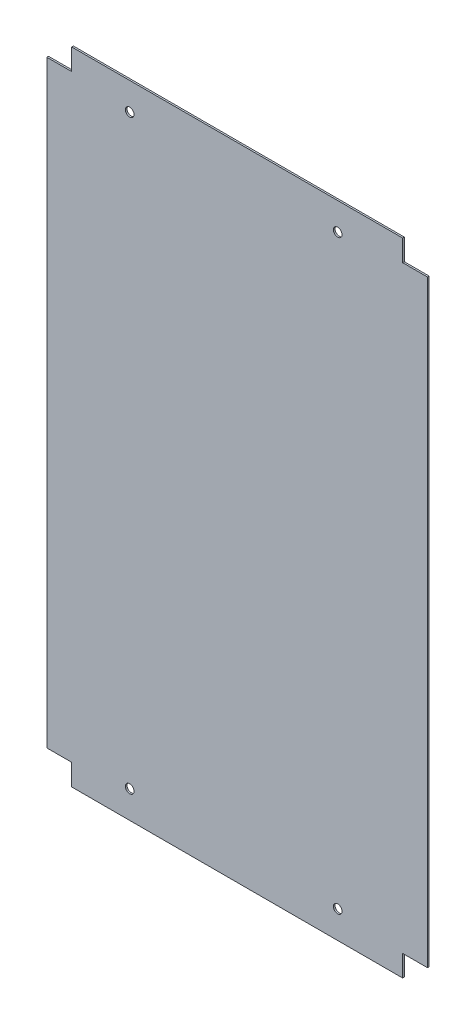
ISO-10303-21;
HEADER;
FILE_DESCRIPTION(('STEP AP214'),'2;1');
FILE_NAME('part.step','',(''),(''),'','','');
FILE_SCHEMA(('AUTOMOTIVE_DESIGN { 1 0 10303 214 1 1 1 1 }'));
ENDSEC;
DATA;
#1=APPLICATION_CONTEXT('core data for automotive mechanical design processes');
#2=APPLICATION_PROTOCOL_DEFINITION('international standard','automotive_design',2000,#1);
#3=PRODUCT_CONTEXT('',#1,'mechanical');
#4=PRODUCT('Part','Part','',(#3));
#5=PRODUCT_RELATED_PRODUCT_CATEGORY('part','',(#4));
#6=PRODUCT_DEFINITION_FORMATION('','',#4);
#7=PRODUCT_DEFINITION_CONTEXT('part definition',#1,'design');
#8=PRODUCT_DEFINITION('design','',#6,#7);
#9=PRODUCT_DEFINITION_SHAPE('','',#8);
#10=(LENGTH_UNIT() NAMED_UNIT(*) SI_UNIT(.MILLI.,.METRE.));
#11=(NAMED_UNIT(*) PLANE_ANGLE_UNIT() SI_UNIT($,.RADIAN.));
#12=(NAMED_UNIT(*) SI_UNIT($,.STERADIAN.) SOLID_ANGLE_UNIT());
#13=UNCERTAINTY_MEASURE_WITH_UNIT(LENGTH_MEASURE(1.E-05),#10,'distance_accuracy_value','');
#14=(GEOMETRIC_REPRESENTATION_CONTEXT(3) GLOBAL_UNCERTAINTY_ASSIGNED_CONTEXT((#13)) GLOBAL_UNIT_ASSIGNED_CONTEXT((#10,
#11,#12)) REPRESENTATION_CONTEXT('',''));
#15=CARTESIAN_POINT('',(0.,0.,0.));
#16=DIRECTION('',(0.,0.,1.));
#17=DIRECTION('',(1.,0.,0.));
#18=AXIS2_PLACEMENT_3D('',#15,#16,#17);
#19=CARTESIAN_POINT('',(0.,0.,-1.524));
#20=DIRECTION('',(0.,0.,-1.));
#21=DIRECTION('',(-1.,0.,0.));
#22=AXIS2_PLACEMENT_3D('',#19,#20,#21);
#23=PLANE('',#22);
#24=CARTESIAN_POINT('',(92.075,268.351,-1.524));
#25=DIRECTION('',(0.,0.,-1.));
#26=DIRECTION('',(-1.,0.,0.));
#27=AXIS2_PLACEMENT_3D('',#24,#25,#26);
#28=CIRCLE('',#27,3.9624);
#29=CARTESIAN_POINT('',(88.1126,268.351,-1.524));
#30=VERTEX_POINT('',#29);
#31=EDGE_CURVE('E379',#30,#30,#28,.T.);
#32=ORIENTED_EDGE('',*,*,#31,.F.);
#33=EDGE_LOOP('',(#32));
#34=FACE_BOUND('',#33,.T.);
#35=CARTESIAN_POINT('',(-98.425,-268.351,-1.524));
#36=DIRECTION('',(0.,0.,-1.));
#37=DIRECTION('',(-1.,0.,0.));
#38=AXIS2_PLACEMENT_3D('',#35,#36,#37);
#39=CIRCLE('',#38,3.96239999999999);
#40=CARTESIAN_POINT('',(-102.3874,-268.351,-1.524));
#41=VERTEX_POINT('',#40);
#42=EDGE_CURVE('E375',#41,#41,#39,.T.);
#43=ORIENTED_EDGE('',*,*,#42,.F.);
#44=EDGE_LOOP('',(#43));
#45=FACE_BOUND('',#44,.T.);
#46=CARTESIAN_POINT('',(92.075,-268.351,-1.524));
#47=DIRECTION('',(0.,0.,-1.));
#48=DIRECTION('',(-1.,0.,0.));
#49=AXIS2_PLACEMENT_3D('',#46,#47,#48);
#50=CIRCLE('',#49,3.9624);
#51=CARTESIAN_POINT('',(88.1126,-268.351,-1.524));
#52=VERTEX_POINT('',#51);
#53=EDGE_CURVE('E371',#52,#52,#50,.T.);
#54=ORIENTED_EDGE('',*,*,#53,.F.);
#55=EDGE_LOOP('',(#54));
#56=FACE_BOUND('',#55,.T.);
#57=CARTESIAN_POINT('',(-98.425,268.351,-1.524));
#58=DIRECTION('',(0.,0.,-1.));
#59=DIRECTION('',(-1.,0.,0.));
#60=AXIS2_PLACEMENT_3D('',#57,#58,#59);
#61=CIRCLE('',#60,3.96239999999999);
#62=CARTESIAN_POINT('',(-102.3874,268.351,-1.524));
#63=VERTEX_POINT('',#62);
#64=EDGE_CURVE('E367',#63,#63,#61,.T.);
#65=ORIENTED_EDGE('',*,*,#64,.F.);
#66=EDGE_LOOP('',(#65));
#67=FACE_BOUND('',#66,.T.);
#68=DIRECTION('',(-1.,0.,0.));
#69=VECTOR('',#68,1.);
#70=CARTESIAN_POINT('',(-157.861,-273.939,-1.524));
#71=LINE('',#70,#69);
#72=CARTESIAN_POINT('',(-151.6634,-273.939,-1.52399999999985));
#73=VERTEX_POINT('',#72);
#74=CARTESIAN_POINT('',(-174.357962531012,-273.939,-1.52399999999989));
#75=VERTEX_POINT('',#74);
#76=EDGE_CURVE('E482',#73,#75,#71,.T.);
#77=ORIENTED_EDGE('',*,*,#76,.T.);
#78=DIRECTION('',(0.,1.,0.));
#79=VECTOR('',#78,1.);
#80=CARTESIAN_POINT('',(-174.357962531012,0.,-1.52399999999986));
#81=LINE('',#80,#79);
#82=CARTESIAN_POINT('',(-174.357962531012,273.939,-1.52399999999983));
#83=VERTEX_POINT('',#82);
#84=EDGE_CURVE('E341',#75,#83,#81,.T.);
#85=ORIENTED_EDGE('',*,*,#84,.T.);
#86=DIRECTION('',(1.,0.,0.));
#87=VECTOR('',#86,1.);
#88=CARTESIAN_POINT('',(-157.861,273.939,-1.524));
#89=LINE('',#88,#87);
#90=CARTESIAN_POINT('',(-151.6634,273.939,-1.524));
#91=VERTEX_POINT('',#90);
#92=EDGE_CURVE('E498',#83,#91,#89,.T.);
#93=ORIENTED_EDGE('',*,*,#92,.T.);
#94=DIRECTION('',(0.,1.,0.));
#95=VECTOR('',#94,1.);
#96=CARTESIAN_POINT('',(-151.6634,273.7866,-1.52399999999992));
#97=LINE('',#96,#95);
#98=CARTESIAN_POINT('',(-151.6634,273.7866,-1.524));
#99=VERTEX_POINT('',#98);
#100=EDGE_CURVE('E452',#99,#91,#97,.T.);
#101=ORIENTED_EDGE('',*,*,#100,.F.);
#102=DIRECTION('',(-1.,0.,0.));
#103=VECTOR('',#102,1.);
#104=CARTESIAN_POINT('',(-151.511,273.7866,-1.52399999999992));
#105=LINE('',#104,#103);
#106=CARTESIAN_POINT('',(-151.511,273.7866,-1.524));
#107=VERTEX_POINT('',#106);
#108=EDGE_CURVE('E447',#107,#99,#105,.T.);
#109=ORIENTED_EDGE('',*,*,#108,.F.);
#110=DIRECTION('',(0.,-1.,0.));
#111=VECTOR('',#110,1.);
#112=CARTESIAN_POINT('',(-151.511,273.939,-1.52399999999992));
#113=LINE('',#112,#111);
#114=CARTESIAN_POINT('',(-151.511,293.483962531012,-1.52399999999997));
#115=VERTEX_POINT('',#114);
#116=EDGE_CURVE('E443',#115,#107,#113,.T.);
#117=ORIENTED_EDGE('',*,*,#116,.F.);
#118=DIRECTION('',(-1.,0.,0.));
#119=VECTOR('',#118,1.);
#120=CARTESIAN_POINT('',(0.,293.483962531012,-1.52399999999997));
#121=LINE('',#120,#119);
#122=CARTESIAN_POINT('',(151.511,293.483962531012,-1.52399999999997));
#123=VERTEX_POINT('',#122);
#124=EDGE_CURVE('E291',#115,#123,#121,.F.);
#125=ORIENTED_EDGE('',*,*,#124,.T.);
#126=DIRECTION('',(0.,1.,0.));
#127=VECTOR('',#126,1.);
#128=CARTESIAN_POINT('',(151.511,273.7866,-1.52399999999992));
#129=LINE('',#128,#127);
#130=CARTESIAN_POINT('',(151.511,273.7866,-1.524));
#131=VERTEX_POINT('',#130);
#132=EDGE_CURVE('E286',#131,#123,#129,.T.);
#133=ORIENTED_EDGE('',*,*,#132,.F.);
#134=DIRECTION('',(-1.,0.,0.));
#135=VECTOR('',#134,1.);
#136=CARTESIAN_POINT('',(151.6634,273.7866,-1.52399999999992));
#137=LINE('',#136,#135);
#138=CARTESIAN_POINT('',(151.6634,273.7866,-1.524));
#139=VERTEX_POINT('',#138);
#140=EDGE_CURVE('E435',#139,#131,#137,.T.);
#141=ORIENTED_EDGE('',*,*,#140,.F.);
#142=DIRECTION('',(0.,-1.,0.));
#143=VECTOR('',#142,1.);
#144=CARTESIAN_POINT('',(151.6634,276.987,-1.52399999999992));
#145=LINE('',#144,#143);
#146=CARTESIAN_POINT('',(151.6634,273.939,-1.52399999999992));
#147=VERTEX_POINT('',#146);
#148=EDGE_CURVE('E281',#147,#139,#145,.T.);
#149=ORIENTED_EDGE('',*,*,#148,.F.);
#150=DIRECTION('',(1.,0.,0.));
#151=VECTOR('',#150,1.);
#152=CARTESIAN_POINT('',(157.861,273.939,-1.524));
#153=LINE('',#152,#151);
#154=CARTESIAN_POINT('',(174.357962531012,273.939,-1.52399999999989));
#155=VERTEX_POINT('',#154);
#156=EDGE_CURVE('E477',#147,#155,#153,.T.);
#157=ORIENTED_EDGE('',*,*,#156,.T.);
#158=DIRECTION('',(0.,-1.,0.));
#159=VECTOR('',#158,1.);
#160=CARTESIAN_POINT('',(174.357962531012,0.,-1.52399999999989));
#161=LINE('',#160,#159);
#162=CARTESIAN_POINT('',(174.357962531012,-273.939,-1.52399999999989));
#163=VERTEX_POINT('',#162);
#164=EDGE_CURVE('E309',#155,#163,#161,.T.);
#165=ORIENTED_EDGE('',*,*,#164,.T.);
#166=DIRECTION('',(-1.,0.,0.));
#167=VECTOR('',#166,1.);
#168=CARTESIAN_POINT('',(157.861,-273.939,-1.524));
#169=LINE('',#168,#167);
#170=CARTESIAN_POINT('',(151.6634,-273.939,-1.524));
#171=VERTEX_POINT('',#170);
#172=EDGE_CURVE('E489',#163,#171,#169,.T.);
#173=ORIENTED_EDGE('',*,*,#172,.T.);
#174=DIRECTION('',(0.,-1.,0.));
#175=VECTOR('',#174,1.);
#176=CARTESIAN_POINT('',(151.6634,-273.7866,-1.52399999999993));
#177=LINE('',#176,#175);
#178=CARTESIAN_POINT('',(151.6634,-273.7866,-1.524));
#179=VERTEX_POINT('',#178);
#180=EDGE_CURVE('E403',#179,#171,#177,.T.);
#181=ORIENTED_EDGE('',*,*,#180,.F.);
#182=DIRECTION('',(1.,0.,0.));
#183=VECTOR('',#182,1.);
#184=CARTESIAN_POINT('',(151.511,-273.7866,-1.52399999999993));
#185=LINE('',#184,#183);
#186=CARTESIAN_POINT('',(151.511,-273.7866,-1.524));
#187=VERTEX_POINT('',#186);
#188=EDGE_CURVE('E398',#187,#179,#185,.T.);
#189=ORIENTED_EDGE('',*,*,#188,.F.);
#190=DIRECTION('',(0.,1.,0.));
#191=VECTOR('',#190,1.);
#192=CARTESIAN_POINT('',(151.511,-273.939,-1.52399999999993));
#193=LINE('',#192,#191);
#194=CARTESIAN_POINT('',(151.511,-293.483962531012,-1.52399999999997));
#195=VERTEX_POINT('',#194);
#196=EDGE_CURVE('E394',#195,#187,#193,.T.);
#197=ORIENTED_EDGE('',*,*,#196,.F.);
#198=DIRECTION('',(-1.,0.,0.));
#199=VECTOR('',#198,1.);
#200=CARTESIAN_POINT('',(0.,-293.483962531013,-1.52399999999991));
#201=LINE('',#200,#199);
#202=CARTESIAN_POINT('',(-151.511,-293.483962531013,-1.52399999999986));
#203=VERTEX_POINT('',#202);
#204=EDGE_CURVE('E326',#195,#203,#201,.T.);
#205=ORIENTED_EDGE('',*,*,#204,.T.);
#206=DIRECTION('',(0.,-1.,0.));
#207=VECTOR('',#206,1.);
#208=CARTESIAN_POINT('',(-151.511,-273.7866,-1.52399999999985));
#209=LINE('',#208,#207);
#210=CARTESIAN_POINT('',(-151.511,-273.7866,-1.524));
#211=VERTEX_POINT('',#210);
#212=EDGE_CURVE('E153',#211,#203,#209,.T.);
#213=ORIENTED_EDGE('',*,*,#212,.F.);
#214=DIRECTION('',(1.,0.,0.));
#215=VECTOR('',#214,1.);
#216=CARTESIAN_POINT('',(-151.6634,-273.7866,-1.52399999999985));
#217=LINE('',#216,#215);
#218=CARTESIAN_POINT('',(-151.6634,-273.7866,-1.524));
#219=VERTEX_POINT('',#218);
#220=EDGE_CURVE('E148',#219,#211,#217,.T.);
#221=ORIENTED_EDGE('',*,*,#220,.F.);
#222=DIRECTION('',(0.,1.,0.));
#223=VECTOR('',#222,1.);
#224=CARTESIAN_POINT('',(-151.6634,-276.987,-1.52399999999985));
#225=LINE('',#224,#223);
#226=EDGE_CURVE('E384',#73,#219,#225,.T.);
#227=ORIENTED_EDGE('',*,*,#226,.F.);
#228=EDGE_LOOP('',(#77,#85,#93,#101,#109,#117,#125,#133,#141,#149,#157,#165,#173,#181,#189,#197,
#205,#213,#221,#227));
#229=FACE_BOUND('',#228,.T.);
#230=ADVANCED_FACE('F132',(#34,#45,#56,#67,#229),#23,.T.);
#231=CARTESIAN_POINT('',(0.,0.,0.));
#232=DIRECTION('',(0.,0.,-1.));
#233=DIRECTION('',(-1.,0.,0.));
#234=AXIS2_PLACEMENT_3D('',#231,#232,#233);
#235=PLANE('',#234);
#236=CARTESIAN_POINT('',(92.075,268.351,0.));
#237=DIRECTION('',(0.,0.,1.));
#238=DIRECTION('',(1.,0.,0.));
#239=AXIS2_PLACEMENT_3D('',#236,#237,#238);
#240=CIRCLE('',#239,3.9624);
#241=CARTESIAN_POINT('',(96.0374,268.351,0.));
#242=VERTEX_POINT('',#241);
#243=EDGE_CURVE('E356',#242,#242,#240,.T.);
#244=ORIENTED_EDGE('',*,*,#243,.F.);
#245=EDGE_LOOP('',(#244));
#246=FACE_BOUND('',#245,.T.);
#247=CARTESIAN_POINT('',(-98.425,-268.351,0.));
#248=DIRECTION('',(0.,0.,1.));
#249=DIRECTION('',(1.,0.,0.));
#250=AXIS2_PLACEMENT_3D('',#247,#248,#249);
#251=CIRCLE('',#250,3.96239999999999);
#252=CARTESIAN_POINT('',(-94.4626,-268.351,0.));
#253=VERTEX_POINT('',#252);
#254=EDGE_CURVE('E355',#253,#253,#251,.T.);
#255=ORIENTED_EDGE('',*,*,#254,.F.);
#256=EDGE_LOOP('',(#255));
#257=FACE_BOUND('',#256,.T.);
#258=CARTESIAN_POINT('',(92.075,-268.351,0.));
#259=DIRECTION('',(0.,0.,1.));
#260=DIRECTION('',(1.,0.,0.));
#261=AXIS2_PLACEMENT_3D('',#258,#259,#260);
#262=CIRCLE('',#261,3.9624);
#263=CARTESIAN_POINT('',(96.0374,-268.351,0.));
#264=VERTEX_POINT('',#263);
#265=EDGE_CURVE('E340',#264,#264,#262,.T.);
#266=ORIENTED_EDGE('',*,*,#265,.F.);
#267=EDGE_LOOP('',(#266));
#268=FACE_BOUND('',#267,.T.);
#269=CARTESIAN_POINT('',(-98.425,268.351,0.));
#270=DIRECTION('',(0.,0.,1.));
#271=DIRECTION('',(1.,0.,0.));
#272=AXIS2_PLACEMENT_3D('',#269,#270,#271);
#273=CIRCLE('',#272,3.96239999999999);
#274=CARTESIAN_POINT('',(-94.4626,268.351,0.));
#275=VERTEX_POINT('',#274);
#276=EDGE_CURVE('E360',#275,#275,#273,.T.);
#277=ORIENTED_EDGE('',*,*,#276,.F.);
#278=EDGE_LOOP('',(#277));
#279=FACE_BOUND('',#278,.T.);
#280=DIRECTION('',(1.,0.,0.));
#281=VECTOR('',#280,1.);
#282=CARTESIAN_POINT('',(-157.861,273.939,0.));
#283=LINE('',#282,#281);
#284=CARTESIAN_POINT('',(-174.357962531012,273.939,1.94289029309402E-13));
#285=VERTEX_POINT('',#284);
#286=CARTESIAN_POINT('',(-151.6634,273.939,0.));
#287=VERTEX_POINT('',#286);
#288=EDGE_CURVE('E481',#285,#287,#283,.T.);
#289=ORIENTED_EDGE('',*,*,#288,.F.);
#290=DIRECTION('',(0.,-1.,0.));
#291=VECTOR('',#290,1.);
#292=CARTESIAN_POINT('',(-174.357962531012,-273.939,1.11022302462516E-13));
#293=LINE('',#292,#291);
#294=CARTESIAN_POINT('',(-174.357962531012,-273.939,1.11022302462516E-13));
#295=VERTEX_POINT('',#294);
#296=EDGE_CURVE('E325',#295,#285,#293,.F.);
#297=ORIENTED_EDGE('',*,*,#296,.F.);
#298=DIRECTION('',(-1.,0.,0.));
#299=VECTOR('',#298,1.);
#300=CARTESIAN_POINT('',(-157.861,-273.939,0.));
#301=LINE('',#300,#299);
#302=CARTESIAN_POINT('',(-151.6634,-273.939,0.));
#303=VERTEX_POINT('',#302);
#304=EDGE_CURVE('E478',#303,#295,#301,.T.);
#305=ORIENTED_EDGE('',*,*,#304,.F.);
#306=DIRECTION('',(0.,-1.,0.));
#307=VECTOR('',#306,1.);
#308=CARTESIAN_POINT('',(-151.6634,0.,0.));
#309=LINE('',#308,#307);
#310=CARTESIAN_POINT('',(-151.6634,-273.7866,0.));
#311=VERTEX_POINT('',#310);
#312=EDGE_CURVE('E423',#311,#303,#309,.T.);
#313=ORIENTED_EDGE('',*,*,#312,.F.);
#314=DIRECTION('',(-1.,0.,0.));
#315=VECTOR('',#314,1.);
#316=CARTESIAN_POINT('',(0.,-273.7866,0.));
#317=LINE('',#316,#315);
#318=CARTESIAN_POINT('',(-151.511,-273.7866,0.));
#319=VERTEX_POINT('',#318);
#320=EDGE_CURVE('E13',#319,#311,#317,.T.);
#321=ORIENTED_EDGE('',*,*,#320,.F.);
#322=DIRECTION('',(0.,1.,0.));
#323=VECTOR('',#322,1.);
#324=CARTESIAN_POINT('',(-151.511,0.,0.));
#325=LINE('',#324,#323);
#326=CARTESIAN_POINT('',(-151.511,-293.483962531013,1.66533453693773E-13));
#327=VERTEX_POINT('',#326);
#328=EDGE_CURVE('E420',#327,#319,#325,.T.);
#329=ORIENTED_EDGE('',*,*,#328,.F.);
#330=DIRECTION('',(1.,0.,0.));
#331=VECTOR('',#330,1.);
#332=CARTESIAN_POINT('',(151.511,-293.483962531012,1.11022302462516E-13));
#333=LINE('',#332,#331);
#334=CARTESIAN_POINT('',(151.511,-293.483962531012,1.11022302462516E-13));
#335=VERTEX_POINT('',#334);
#336=EDGE_CURVE('E308',#335,#327,#333,.F.);
#337=ORIENTED_EDGE('',*,*,#336,.F.);
#338=DIRECTION('',(0.,-1.,0.));
#339=VECTOR('',#338,1.);
#340=CARTESIAN_POINT('',(151.511,0.,0.));
#341=LINE('',#340,#339);
#342=CARTESIAN_POINT('',(151.511,-273.7866,0.));
#343=VERTEX_POINT('',#342);
#344=EDGE_CURVE('E387',#343,#335,#341,.T.);
#345=ORIENTED_EDGE('',*,*,#344,.F.);
#346=DIRECTION('',(-1.,0.,0.));
#347=VECTOR('',#346,1.);
#348=CARTESIAN_POINT('',(0.,-273.7866,0.));
#349=LINE('',#348,#347);
#350=CARTESIAN_POINT('',(151.6634,-273.7866,0.));
#351=VERTEX_POINT('',#350);
#352=EDGE_CURVE('E141',#351,#343,#349,.T.);
#353=ORIENTED_EDGE('',*,*,#352,.F.);
#354=DIRECTION('',(0.,1.,0.));
#355=VECTOR('',#354,1.);
#356=CARTESIAN_POINT('',(151.6634,0.,0.));
#357=LINE('',#356,#355);
#358=CARTESIAN_POINT('',(151.6634,-273.939,0.));
#359=VERTEX_POINT('',#358);
#360=EDGE_CURVE('E427',#359,#351,#357,.T.);
#361=ORIENTED_EDGE('',*,*,#360,.F.);
#362=DIRECTION('',(-1.,0.,0.));
#363=VECTOR('',#362,1.);
#364=CARTESIAN_POINT('',(157.861,-273.939,0.));
#365=LINE('',#364,#363);
#366=CARTESIAN_POINT('',(174.357962531012,-273.939,1.11022302462516E-13));
#367=VERTEX_POINT('',#366);
#368=EDGE_CURVE('E485',#367,#359,#365,.T.);
#369=ORIENTED_EDGE('',*,*,#368,.F.);
#370=DIRECTION('',(0.,1.,0.));
#371=VECTOR('',#370,1.);
#372=CARTESIAN_POINT('',(174.357962531012,273.939,1.11022302462516E-13));
#373=LINE('',#372,#371);
#374=CARTESIAN_POINT('',(174.357962531012,273.939,1.11022302462516E-13));
#375=VERTEX_POINT('',#374);
#376=EDGE_CURVE('E317',#375,#367,#373,.F.);
#377=ORIENTED_EDGE('',*,*,#376,.F.);
#378=DIRECTION('',(1.,0.,0.));
#379=VECTOR('',#378,1.);
#380=CARTESIAN_POINT('',(157.861,273.939,0.));
#381=LINE('',#380,#379);
#382=CARTESIAN_POINT('',(151.6634,273.939,0.));
#383=VERTEX_POINT('',#382);
#384=EDGE_CURVE('E493',#383,#375,#381,.T.);
#385=ORIENTED_EDGE('',*,*,#384,.F.);
#386=DIRECTION('',(0.,1.,0.));
#387=VECTOR('',#386,1.);
#388=CARTESIAN_POINT('',(151.6634,0.,0.));
#389=LINE('',#388,#387);
#390=CARTESIAN_POINT('',(151.6634,273.7866,0.));
#391=VERTEX_POINT('',#390);
#392=EDGE_CURVE('E280',#391,#383,#389,.T.);
#393=ORIENTED_EDGE('',*,*,#392,.F.);
#394=DIRECTION('',(1.,0.,0.));
#395=VECTOR('',#394,1.);
#396=CARTESIAN_POINT('',(0.,273.7866,0.));
#397=LINE('',#396,#395);
#398=CARTESIAN_POINT('',(151.511,273.7866,0.));
#399=VERTEX_POINT('',#398);
#400=EDGE_CURVE('E275',#399,#391,#397,.T.);
#401=ORIENTED_EDGE('',*,*,#400,.F.);
#402=DIRECTION('',(0.,-1.,0.));
#403=VECTOR('',#402,1.);
#404=CARTESIAN_POINT('',(151.511,0.,0.));
#405=LINE('',#404,#403);
#406=CARTESIAN_POINT('',(151.511,293.483962531012,0.));
#407=VERTEX_POINT('',#406);
#408=EDGE_CURVE('E270',#407,#399,#405,.T.);
#409=ORIENTED_EDGE('',*,*,#408,.F.);
#410=DIRECTION('',(1.,0.,0.));
#411=VECTOR('',#410,1.);
#412=CARTESIAN_POINT('',(151.511,293.483962531012,0.));
#413=LINE('',#412,#411);
#414=CARTESIAN_POINT('',(-151.511,293.483962531012,1.11022302462516E-13));
#415=VERTEX_POINT('',#414);
#416=EDGE_CURVE('E273',#415,#407,#413,.T.);
#417=ORIENTED_EDGE('',*,*,#416,.F.);
#418=DIRECTION('',(0.,1.,0.));
#419=VECTOR('',#418,1.);
#420=CARTESIAN_POINT('',(-151.511,0.,0.));
#421=LINE('',#420,#419);
#422=CARTESIAN_POINT('',(-151.511,273.7866,0.));
#423=VERTEX_POINT('',#422);
#424=EDGE_CURVE('E474',#423,#415,#421,.T.);
#425=ORIENTED_EDGE('',*,*,#424,.F.);
#426=DIRECTION('',(1.,0.,0.));
#427=VECTOR('',#426,1.);
#428=CARTESIAN_POINT('',(0.,273.7866,0.));
#429=LINE('',#428,#427);
#430=CARTESIAN_POINT('',(-151.6634,273.7866,0.));
#431=VERTEX_POINT('',#430);
#432=EDGE_CURVE('E511',#431,#423,#429,.T.);
#433=ORIENTED_EDGE('',*,*,#432,.F.);
#434=DIRECTION('',(0.,-1.,0.));
#435=VECTOR('',#434,1.);
#436=CARTESIAN_POINT('',(-151.6634,0.,0.));
#437=LINE('',#436,#435);
#438=EDGE_CURVE('E470',#287,#431,#437,.T.);
#439=ORIENTED_EDGE('',*,*,#438,.F.);
#440=EDGE_LOOP('',(#289,#297,#305,#313,#321,#329,#337,#345,#353,#361,#369,#377,#385,#393,#401,
#409,#417,#425,#433,#439));
#441=FACE_BOUND('',#440,.T.);
#442=ADVANCED_FACE('F134',(#246,#257,#268,#279,#441),#235,.F.);
#443=CARTESIAN_POINT('',(-157.861,-273.939,-1.524));
#444=DIRECTION('',(0.,1.,0.));
#445=DIRECTION('',(0.,0.,1.));
#446=AXIS2_PLACEMENT_3D('',#443,#444,#445);
#447=PLANE('',#446);
#448=ORIENTED_EDGE('',*,*,#304,.T.);
#449=DIRECTION('',(0.,0.,-1.));
#450=VECTOR('',#449,1.);
#451=CARTESIAN_POINT('',(-174.357962531012,-273.939,0.));
#452=LINE('',#451,#450);
#453=EDGE_CURVE('E336',#295,#75,#452,.T.);
#454=ORIENTED_EDGE('',*,*,#453,.T.);
#455=ORIENTED_EDGE('',*,*,#76,.F.);
#456=DIRECTION('',(0.,0.,-1.));
#457=VECTOR('',#456,1.);
#458=CARTESIAN_POINT('',(-151.6634,-273.939,-1.524));
#459=LINE('',#458,#457);
#460=EDGE_CURVE('E517',#303,#73,#459,.T.);
#461=ORIENTED_EDGE('',*,*,#460,.F.);
#462=EDGE_LOOP('',(#448,#454,#455,#461));
#463=FACE_BOUND('',#462,.T.);
#464=ADVANCED_FACE('F578',(#463),#447,.F.);
#465=CARTESIAN_POINT('',(-157.861,273.939,-1.524));
#466=DIRECTION('',(0.,-1.,0.));
#467=DIRECTION('',(0.,0.,-1.));
#468=AXIS2_PLACEMENT_3D('',#465,#466,#467);
#469=PLANE('',#468);
#470=ORIENTED_EDGE('',*,*,#92,.F.);
#471=DIRECTION('',(0.,0.,-1.));
#472=VECTOR('',#471,1.);
#473=CARTESIAN_POINT('',(-174.357962531012,273.939,1.94289029309402E-13));
#474=LINE('',#473,#472);
#475=EDGE_CURVE('E345',#285,#83,#474,.T.);
#476=ORIENTED_EDGE('',*,*,#475,.F.);
#477=ORIENTED_EDGE('',*,*,#288,.T.);
#478=DIRECTION('',(0.,0.,1.));
#479=VECTOR('',#478,1.);
#480=CARTESIAN_POINT('',(-151.6634,273.939,-1.524));
#481=LINE('',#480,#479);
#482=EDGE_CURVE('E507',#91,#287,#481,.T.);
#483=ORIENTED_EDGE('',*,*,#482,.F.);
#484=EDGE_LOOP('',(#470,#476,#477,#483));
#485=FACE_BOUND('',#484,.T.);
#486=ADVANCED_FACE('F572',(#485),#469,.F.);
#487=CARTESIAN_POINT('',(-151.6634,-273.7866,-1.52399999999985));
#488=DIRECTION('',(0.,-1.,0.));
#489=DIRECTION('',(0.,0.,-1.));
#490=AXIS2_PLACEMENT_3D('',#487,#488,#489);
#491=PLANE('',#490);
#492=DIRECTION('',(0.,0.,1.));
#493=VECTOR('',#492,1.);
#494=CARTESIAN_POINT('',(-151.511,-273.7866,-1.52399999999985));
#495=LINE('',#494,#493);
#496=EDGE_CURVE('E393',#211,#319,#495,.T.);
#497=ORIENTED_EDGE('',*,*,#496,.T.);
#498=ORIENTED_EDGE('',*,*,#320,.T.);
#499=DIRECTION('',(0.,0.,1.));
#500=VECTOR('',#499,1.);
#501=CARTESIAN_POINT('',(-151.6634,-273.7866,-1.52399999999985));
#502=LINE('',#501,#500);
#503=EDGE_CURVE('E390',#219,#311,#502,.T.);
#504=ORIENTED_EDGE('',*,*,#503,.F.);
#505=ORIENTED_EDGE('',*,*,#220,.T.);
#506=EDGE_LOOP('',(#497,#498,#504,#505));
#507=FACE_BOUND('',#506,.T.);
#508=ADVANCED_FACE('F583',(#507),#491,.T.);
#509=CARTESIAN_POINT('',(151.511,-273.7866,-1.52399999999993));
#510=DIRECTION('',(0.,-1.,0.));
#511=DIRECTION('',(0.,0.,-1.));
#512=AXIS2_PLACEMENT_3D('',#509,#510,#511);
#513=PLANE('',#512);
#514=DIRECTION('',(0.,0.,1.));
#515=VECTOR('',#514,1.);
#516=CARTESIAN_POINT('',(151.6634,-273.7866,-1.52399999999993));
#517=LINE('',#516,#515);
#518=EDGE_CURVE('E383',#179,#351,#517,.T.);
#519=ORIENTED_EDGE('',*,*,#518,.T.);
#520=ORIENTED_EDGE('',*,*,#352,.T.);
#521=DIRECTION('',(0.,0.,1.));
#522=VECTOR('',#521,1.);
#523=CARTESIAN_POINT('',(151.511,-273.7866,-1.52399999999993));
#524=LINE('',#523,#522);
#525=EDGE_CURVE('E402',#187,#343,#524,.T.);
#526=ORIENTED_EDGE('',*,*,#525,.F.);
#527=ORIENTED_EDGE('',*,*,#188,.T.);
#528=EDGE_LOOP('',(#519,#520,#526,#527));
#529=FACE_BOUND('',#528,.T.);
#530=ADVANCED_FACE('F529',(#529),#513,.T.);
#531=CARTESIAN_POINT('',(151.6634,-273.7866,-1.52399999999993));
#532=DIRECTION('',(-1.,0.,0.));
#533=DIRECTION('',(0.,0.,1.));
#534=AXIS2_PLACEMENT_3D('',#531,#532,#533);
#535=PLANE('',#534);
#536=DIRECTION('',(0.,0.,1.));
#537=VECTOR('',#536,1.);
#538=CARTESIAN_POINT('',(151.6634,-273.939,-1.524));
#539=LINE('',#538,#537);
#540=EDGE_CURVE('E521',#171,#359,#539,.T.);
#541=ORIENTED_EDGE('',*,*,#540,.T.);
#542=ORIENTED_EDGE('',*,*,#360,.T.);
#543=ORIENTED_EDGE('',*,*,#518,.F.);
#544=ORIENTED_EDGE('',*,*,#180,.T.);
#545=EDGE_LOOP('',(#541,#542,#543,#544));
#546=FACE_BOUND('',#545,.T.);
#547=ADVANCED_FACE('F536',(#546),#535,.T.);
#548=CARTESIAN_POINT('',(-151.6634,-276.987,-1.52399999999985));
#549=DIRECTION('',(1.,0.,0.));
#550=DIRECTION('',(0.,0.,-1.));
#551=AXIS2_PLACEMENT_3D('',#548,#549,#550);
#552=PLANE('',#551);
#553=ORIENTED_EDGE('',*,*,#503,.T.);
#554=ORIENTED_EDGE('',*,*,#312,.T.);
#555=ORIENTED_EDGE('',*,*,#460,.T.);
#556=ORIENTED_EDGE('',*,*,#226,.T.);
#557=EDGE_LOOP('',(#553,#554,#555,#556));
#558=FACE_BOUND('',#557,.T.);
#559=ADVANCED_FACE('F580',(#558),#552,.T.);
#560=CARTESIAN_POINT('',(-151.511,-273.7866,-1.52399999999985));
#561=DIRECTION('',(-1.,0.,0.));
#562=DIRECTION('',(0.,0.,1.));
#563=AXIS2_PLACEMENT_3D('',#560,#561,#562);
#564=PLANE('',#563);
#565=ORIENTED_EDGE('',*,*,#212,.T.);
#566=DIRECTION('',(0.,0.,-1.));
#567=VECTOR('',#566,1.);
#568=CARTESIAN_POINT('',(-151.511,-293.483962531013,1.66533453693773E-13));
#569=LINE('',#568,#567);
#570=EDGE_CURVE('E329',#327,#203,#569,.T.);
#571=ORIENTED_EDGE('',*,*,#570,.F.);
#572=ORIENTED_EDGE('',*,*,#328,.T.);
#573=ORIENTED_EDGE('',*,*,#496,.F.);
#574=EDGE_LOOP('',(#565,#571,#572,#573));
#575=FACE_BOUND('',#574,.T.);
#576=ADVANCED_FACE('F587',(#575),#564,.T.);
#577=CARTESIAN_POINT('',(151.511,-273.939,-1.52399999999993));
#578=DIRECTION('',(1.,0.,0.));
#579=DIRECTION('',(0.,0.,-1.));
#580=AXIS2_PLACEMENT_3D('',#577,#578,#579);
#581=PLANE('',#580);
#582=ORIENTED_EDGE('',*,*,#525,.T.);
#583=ORIENTED_EDGE('',*,*,#344,.T.);
#584=DIRECTION('',(0.,0.,-1.));
#585=VECTOR('',#584,1.);
#586=CARTESIAN_POINT('',(151.511,-293.483962531012,1.11022302462516E-13));
#587=LINE('',#586,#585);
#588=EDGE_CURVE('E321',#335,#195,#587,.T.);
#589=ORIENTED_EDGE('',*,*,#588,.T.);
#590=ORIENTED_EDGE('',*,*,#196,.T.);
#591=EDGE_LOOP('',(#582,#583,#589,#590));
#592=FACE_BOUND('',#591,.T.);
#593=ADVANCED_FACE('F532',(#592),#581,.T.);
#594=CARTESIAN_POINT('',(157.861,-273.939,-1.524));
#595=DIRECTION('',(0.,1.,0.));
#596=DIRECTION('',(-1.,0.,0.));
#597=AXIS2_PLACEMENT_3D('',#594,#595,#596);
#598=PLANE('',#597);
#599=ORIENTED_EDGE('',*,*,#540,.F.);
#600=ORIENTED_EDGE('',*,*,#172,.F.);
#601=DIRECTION('',(0.,0.,-1.));
#602=VECTOR('',#601,1.);
#603=CARTESIAN_POINT('',(174.357962531012,-273.939,1.11022302462516E-13));
#604=LINE('',#603,#602);
#605=EDGE_CURVE('E313',#367,#163,#604,.T.);
#606=ORIENTED_EDGE('',*,*,#605,.F.);
#607=ORIENTED_EDGE('',*,*,#368,.T.);
#608=EDGE_LOOP('',(#599,#600,#606,#607));
#609=FACE_BOUND('',#608,.T.);
#610=ADVANCED_FACE('F540',(#609),#598,.F.);
#611=CARTESIAN_POINT('',(157.861,273.939,-1.524));
#612=DIRECTION('',(0.,-1.,0.));
#613=DIRECTION('',(0.,0.,-1.));
#614=AXIS2_PLACEMENT_3D('',#611,#612,#613);
#615=PLANE('',#614);
#616=ORIENTED_EDGE('',*,*,#384,.T.);
#617=DIRECTION('',(0.,0.,-1.));
#618=VECTOR('',#617,1.);
#619=CARTESIAN_POINT('',(174.357962531012,273.939,1.11022302462516E-13));
#620=LINE('',#619,#618);
#621=EDGE_CURVE('E304',#375,#155,#620,.T.);
#622=ORIENTED_EDGE('',*,*,#621,.T.);
#623=ORIENTED_EDGE('',*,*,#156,.F.);
#624=DIRECTION('',(0.,0.,-1.));
#625=VECTOR('',#624,1.);
#626=CARTESIAN_POINT('',(151.6634,273.939,-1.524));
#627=LINE('',#626,#625);
#628=EDGE_CURVE('E501',#383,#147,#627,.T.);
#629=ORIENTED_EDGE('',*,*,#628,.F.);
#630=EDGE_LOOP('',(#616,#622,#623,#629));
#631=FACE_BOUND('',#630,.T.);
#632=ADVANCED_FACE('F610',(#631),#615,.F.);
#633=CARTESIAN_POINT('',(151.6634,273.7866,-1.52399999999992));
#634=DIRECTION('',(0.,1.,0.));
#635=DIRECTION('',(0.,0.,1.));
#636=AXIS2_PLACEMENT_3D('',#633,#634,#635);
#637=PLANE('',#636);
#638=DIRECTION('',(0.,0.,1.));
#639=VECTOR('',#638,1.);
#640=CARTESIAN_POINT('',(151.511,273.7866,-1.52399999999992));
#641=LINE('',#640,#639);
#642=EDGE_CURVE('E442',#131,#399,#641,.T.);
#643=ORIENTED_EDGE('',*,*,#642,.T.);
#644=ORIENTED_EDGE('',*,*,#400,.T.);
#645=DIRECTION('',(0.,0.,1.));
#646=VECTOR('',#645,1.);
#647=CARTESIAN_POINT('',(151.6634,273.7866,-1.52399999999992));
#648=LINE('',#647,#646);
#649=EDGE_CURVE('E439',#139,#391,#648,.T.);
#650=ORIENTED_EDGE('',*,*,#649,.F.);
#651=ORIENTED_EDGE('',*,*,#140,.T.);
#652=EDGE_LOOP('',(#643,#644,#650,#651));
#653=FACE_BOUND('',#652,.T.);
#654=ADVANCED_FACE('F552',(#653),#637,.T.);
#655=CARTESIAN_POINT('',(-151.511,273.7866,-1.52399999999992));
#656=DIRECTION('',(0.,1.,0.));
#657=DIRECTION('',(0.,0.,1.));
#658=AXIS2_PLACEMENT_3D('',#655,#656,#657);
#659=PLANE('',#658);
#660=DIRECTION('',(0.,0.,1.));
#661=VECTOR('',#660,1.);
#662=CARTESIAN_POINT('',(-151.6634,273.7866,-1.52399999999992));
#663=LINE('',#662,#661);
#664=EDGE_CURVE('E431',#99,#431,#663,.T.);
#665=ORIENTED_EDGE('',*,*,#664,.T.);
#666=ORIENTED_EDGE('',*,*,#432,.T.);
#667=DIRECTION('',(0.,0.,1.));
#668=VECTOR('',#667,1.);
#669=CARTESIAN_POINT('',(-151.511,273.7866,-1.52399999999992));
#670=LINE('',#669,#668);
#671=EDGE_CURVE('E451',#107,#423,#670,.T.);
#672=ORIENTED_EDGE('',*,*,#671,.F.);
#673=ORIENTED_EDGE('',*,*,#108,.T.);
#674=EDGE_LOOP('',(#665,#666,#672,#673));
#675=FACE_BOUND('',#674,.T.);
#676=ADVANCED_FACE('F563',(#675),#659,.T.);
#677=CARTESIAN_POINT('',(-151.511,273.939,-1.52399999999992));
#678=DIRECTION('',(-1.,0.,0.));
#679=DIRECTION('',(0.,0.,1.));
#680=AXIS2_PLACEMENT_3D('',#677,#678,#679);
#681=PLANE('',#680);
#682=ORIENTED_EDGE('',*,*,#671,.T.);
#683=ORIENTED_EDGE('',*,*,#424,.T.);
#684=DIRECTION('',(0.,0.,-1.));
#685=VECTOR('',#684,1.);
#686=CARTESIAN_POINT('',(-151.511,293.483962531012,0.));
#687=LINE('',#686,#685);
#688=EDGE_CURVE('E296',#415,#115,#687,.T.);
#689=ORIENTED_EDGE('',*,*,#688,.T.);
#690=ORIENTED_EDGE('',*,*,#116,.T.);
#691=EDGE_LOOP('',(#682,#683,#689,#690));
#692=FACE_BOUND('',#691,.T.);
#693=ADVANCED_FACE('F559',(#692),#681,.T.);
#694=CARTESIAN_POINT('',(-151.6634,273.7866,-1.52399999999992));
#695=DIRECTION('',(1.,0.,0.));
#696=DIRECTION('',(0.,0.,-1.));
#697=AXIS2_PLACEMENT_3D('',#694,#695,#696);
#698=PLANE('',#697);
#699=ORIENTED_EDGE('',*,*,#482,.T.);
#700=ORIENTED_EDGE('',*,*,#438,.T.);
#701=ORIENTED_EDGE('',*,*,#664,.F.);
#702=ORIENTED_EDGE('',*,*,#100,.T.);
#703=EDGE_LOOP('',(#699,#700,#701,#702));
#704=FACE_BOUND('',#703,.T.);
#705=ADVANCED_FACE('F566',(#704),#698,.T.);
#706=CARTESIAN_POINT('',(151.6634,276.987,-1.52399999999992));
#707=DIRECTION('',(-1.,0.,0.));
#708=DIRECTION('',(0.,0.,1.));
#709=AXIS2_PLACEMENT_3D('',#706,#707,#708);
#710=PLANE('',#709);
#711=ORIENTED_EDGE('',*,*,#649,.T.);
#712=ORIENTED_EDGE('',*,*,#392,.T.);
#713=ORIENTED_EDGE('',*,*,#628,.T.);
#714=ORIENTED_EDGE('',*,*,#148,.T.);
#715=EDGE_LOOP('',(#711,#712,#713,#714));
#716=FACE_BOUND('',#715,.T.);
#717=ADVANCED_FACE('F548',(#716),#710,.T.);
#718=CARTESIAN_POINT('',(151.511,273.7866,-1.52399999999992));
#719=DIRECTION('',(1.,0.,0.));
#720=DIRECTION('',(0.,0.,-1.));
#721=AXIS2_PLACEMENT_3D('',#718,#719,#720);
#722=PLANE('',#721);
#723=ORIENTED_EDGE('',*,*,#132,.T.);
#724=DIRECTION('',(0.,0.,-1.));
#725=VECTOR('',#724,1.);
#726=CARTESIAN_POINT('',(151.511,293.483962531012,0.));
#727=LINE('',#726,#725);
#728=EDGE_CURVE('E284',#407,#123,#727,.T.);
#729=ORIENTED_EDGE('',*,*,#728,.F.);
#730=ORIENTED_EDGE('',*,*,#408,.T.);
#731=ORIENTED_EDGE('',*,*,#642,.F.);
#732=EDGE_LOOP('',(#723,#729,#730,#731));
#733=FACE_BOUND('',#732,.T.);
#734=ADVANCED_FACE('F285',(#733),#722,.T.);
#735=CARTESIAN_POINT('',(-98.425,268.351,-19.05));
#736=DIRECTION('',(0.,0.,1.));
#737=DIRECTION('',(1.,0.,0.));
#738=AXIS2_PLACEMENT_3D('',#735,#736,#737);
#739=CYLINDRICAL_SURFACE('',#738,3.96239999999999);
#740=ORIENTED_EDGE('',*,*,#64,.T.);
#741=EDGE_LOOP('',(#740));
#742=FACE_BOUND('',#741,.T.);
#743=ORIENTED_EDGE('',*,*,#276,.T.);
#744=EDGE_LOOP('',(#743));
#745=FACE_BOUND('',#744,.T.);
#746=ADVANCED_FACE('F623',(#742,#745),#739,.F.);
#747=CARTESIAN_POINT('',(92.075,-268.351,-19.05));
#748=DIRECTION('',(0.,0.,1.));
#749=DIRECTION('',(1.,0.,0.));
#750=AXIS2_PLACEMENT_3D('',#747,#748,#749);
#751=CYLINDRICAL_SURFACE('',#750,3.9624);
#752=ORIENTED_EDGE('',*,*,#53,.T.);
#753=EDGE_LOOP('',(#752));
#754=FACE_BOUND('',#753,.T.);
#755=ORIENTED_EDGE('',*,*,#265,.T.);
#756=EDGE_LOOP('',(#755));
#757=FACE_BOUND('',#756,.T.);
#758=ADVANCED_FACE('F644',(#754,#757),#751,.F.);
#759=CARTESIAN_POINT('',(-98.425,-268.351,-19.05));
#760=DIRECTION('',(0.,0.,1.));
#761=DIRECTION('',(1.,0.,0.));
#762=AXIS2_PLACEMENT_3D('',#759,#760,#761);
#763=CYLINDRICAL_SURFACE('',#762,3.96239999999999);
#764=ORIENTED_EDGE('',*,*,#42,.T.);
#765=EDGE_LOOP('',(#764));
#766=FACE_BOUND('',#765,.T.);
#767=ORIENTED_EDGE('',*,*,#254,.T.);
#768=EDGE_LOOP('',(#767));
#769=FACE_BOUND('',#768,.T.);
#770=ADVANCED_FACE('F646',(#766,#769),#763,.F.);
#771=CARTESIAN_POINT('',(92.075,268.351,-19.05));
#772=DIRECTION('',(0.,0.,1.));
#773=DIRECTION('',(1.,0.,0.));
#774=AXIS2_PLACEMENT_3D('',#771,#772,#773);
#775=CYLINDRICAL_SURFACE('',#774,3.9624);
#776=ORIENTED_EDGE('',*,*,#31,.T.);
#777=EDGE_LOOP('',(#776));
#778=FACE_BOUND('',#777,.T.);
#779=ORIENTED_EDGE('',*,*,#243,.T.);
#780=EDGE_LOOP('',(#779));
#781=FACE_BOUND('',#780,.T.);
#782=ADVANCED_FACE('F597',(#778,#781),#775,.F.);
#783=CARTESIAN_POINT('',(-174.357962531012,-273.939,1.11022302462516E-13));
#784=DIRECTION('',(-1.,0.,0.));
#785=DIRECTION('',(0.,0.,1.));
#786=AXIS2_PLACEMENT_3D('',#783,#784,#785);
#787=PLANE('',#786);
#788=ORIENTED_EDGE('',*,*,#84,.F.);
#789=ORIENTED_EDGE('',*,*,#453,.F.);
#790=ORIENTED_EDGE('',*,*,#296,.T.);
#791=ORIENTED_EDGE('',*,*,#475,.T.);
#792=EDGE_LOOP('',(#788,#789,#790,#791));
#793=FACE_BOUND('',#792,.T.);
#794=ADVANCED_FACE('F576',(#793),#787,.T.);
#795=CARTESIAN_POINT('',(151.511,-293.483962531012,1.11022302462516E-13));
#796=DIRECTION('',(0.,-1.,0.));
#797=DIRECTION('',(0.,0.,-1.));
#798=AXIS2_PLACEMENT_3D('',#795,#796,#797);
#799=PLANE('',#798);
#800=ORIENTED_EDGE('',*,*,#204,.F.);
#801=ORIENTED_EDGE('',*,*,#588,.F.);
#802=ORIENTED_EDGE('',*,*,#336,.T.);
#803=ORIENTED_EDGE('',*,*,#570,.T.);
#804=EDGE_LOOP('',(#800,#801,#802,#803));
#805=FACE_BOUND('',#804,.T.);
#806=ADVANCED_FACE('F589',(#805),#799,.T.);
#807=CARTESIAN_POINT('',(174.357962531012,273.939,1.11022302462516E-13));
#808=DIRECTION('',(1.,0.,0.));
#809=DIRECTION('',(0.,0.,-1.));
#810=AXIS2_PLACEMENT_3D('',#807,#808,#809);
#811=PLANE('',#810);
#812=ORIENTED_EDGE('',*,*,#164,.F.);
#813=ORIENTED_EDGE('',*,*,#621,.F.);
#814=ORIENTED_EDGE('',*,*,#376,.T.);
#815=ORIENTED_EDGE('',*,*,#605,.T.);
#816=EDGE_LOOP('',(#812,#813,#814,#815));
#817=FACE_BOUND('',#816,.T.);
#818=ADVANCED_FACE('F544',(#817),#811,.T.);
#819=CARTESIAN_POINT('',(151.511,293.483962531012,0.));
#820=DIRECTION('',(0.,1.,0.));
#821=DIRECTION('',(0.,0.,1.));
#822=AXIS2_PLACEMENT_3D('',#819,#820,#821);
#823=PLANE('',#822);
#824=ORIENTED_EDGE('',*,*,#124,.F.);
#825=ORIENTED_EDGE('',*,*,#688,.F.);
#826=ORIENTED_EDGE('',*,*,#416,.T.);
#827=ORIENTED_EDGE('',*,*,#728,.T.);
#828=EDGE_LOOP('',(#824,#825,#826,#827));
#829=FACE_BOUND('',#828,.T.);
#830=ADVANCED_FACE('F294',(#829),#823,.T.);
#831=CLOSED_SHELL('',(#230,#442,#464,#486,#508,#530,#547,#559,#576,#593,#610,#632,#654,#676,
#693,#705,#717,#734,#746,#758,#770,#782,#794,#806,#818,#830));
#832=MANIFOLD_SOLID_BREP('B2',#831);
#833=ADVANCED_BREP_SHAPE_REPRESENTATION('',(#18,#832),#14);
#834=SHAPE_DEFINITION_REPRESENTATION(#9,#833);
ENDSEC;
END-ISO-10303-21;
